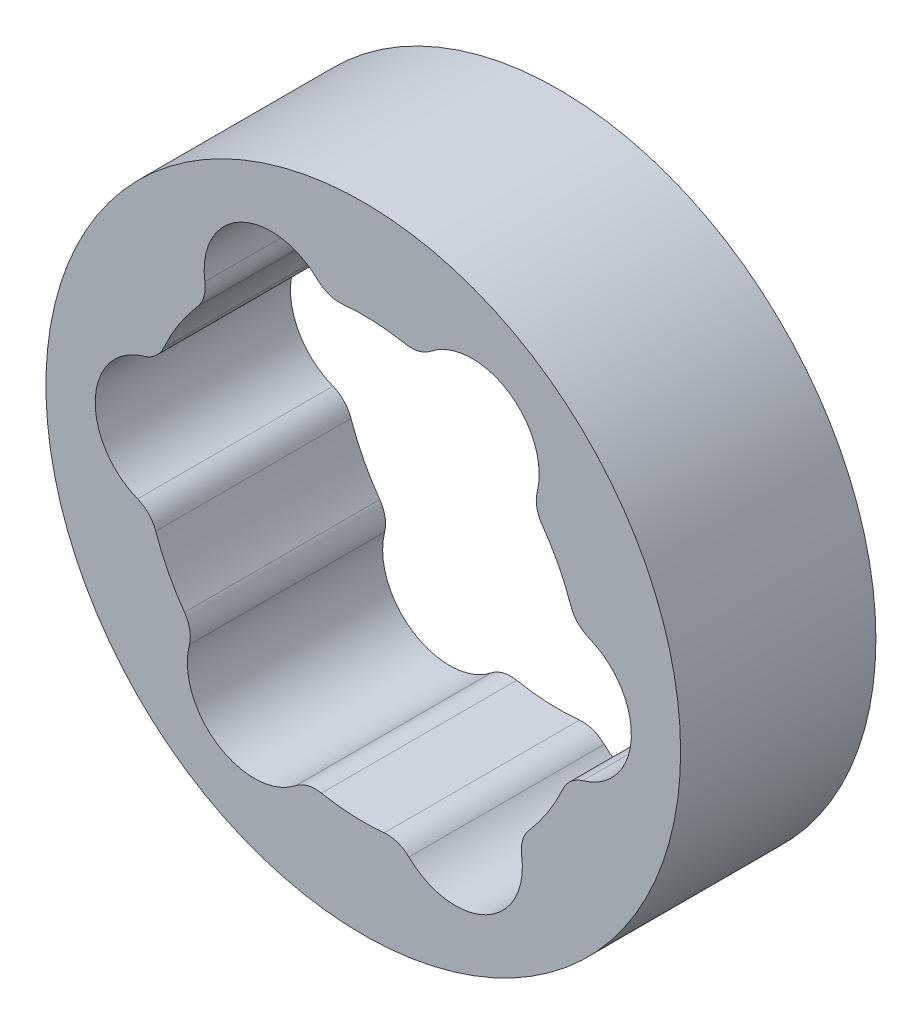
ISO-10303-21;
HEADER;
FILE_DESCRIPTION(('STEP AP214'),'2;1');
FILE_NAME('part.step','',(''),(''),'','','');
FILE_SCHEMA(('AUTOMOTIVE_DESIGN { 1 0 10303 214 1 1 1 1 }'));
ENDSEC;
DATA;
#1=APPLICATION_CONTEXT('core data for automotive mechanical design processes');
#2=APPLICATION_PROTOCOL_DEFINITION('international standard','automotive_design',2000,#1);
#3=PRODUCT_CONTEXT('',#1,'mechanical');
#4=PRODUCT('Part','Part','',(#3));
#5=PRODUCT_RELATED_PRODUCT_CATEGORY('part','',(#4));
#6=PRODUCT_DEFINITION_FORMATION('','',#4);
#7=PRODUCT_DEFINITION_CONTEXT('part definition',#1,'design');
#8=PRODUCT_DEFINITION('design','',#6,#7);
#9=PRODUCT_DEFINITION_SHAPE('','',#8);
#10=(LENGTH_UNIT() NAMED_UNIT(*) SI_UNIT(.MILLI.,.METRE.));
#11=(NAMED_UNIT(*) PLANE_ANGLE_UNIT() SI_UNIT($,.RADIAN.));
#12=(NAMED_UNIT(*) SI_UNIT($,.STERADIAN.) SOLID_ANGLE_UNIT());
#13=UNCERTAINTY_MEASURE_WITH_UNIT(LENGTH_MEASURE(1.E-05),#10,'distance_accuracy_value','');
#14=(GEOMETRIC_REPRESENTATION_CONTEXT(3) GLOBAL_UNCERTAINTY_ASSIGNED_CONTEXT((#13)) GLOBAL_UNIT_ASSIGNED_CONTEXT((#10,
#11,#12)) REPRESENTATION_CONTEXT('',''));
#15=CARTESIAN_POINT('',(0.,0.,0.));
#16=DIRECTION('',(0.,0.,1.));
#17=DIRECTION('',(1.,0.,0.));
#18=AXIS2_PLACEMENT_3D('',#15,#16,#17);
#19=CARTESIAN_POINT('',(0.,0.,12.7));
#20=DIRECTION('',(0.,0.,1.));
#21=DIRECTION('',(1.,0.,0.));
#22=AXIS2_PLACEMENT_3D('',#19,#20,#21);
#23=PLANE('',#22);
#24=CARTESIAN_POINT('',(596.895342550677,221.989731649152,12.7));
#25=DIRECTION('',(0.,0.,1.));
#26=DIRECTION('',(1.,0.,0.));
#27=AXIS2_PLACEMENT_3D('',#24,#25,#26);
#28=CIRCLE('',#27,20.6375);
#29=CARTESIAN_POINT('',(617.532842550677,221.989731649152,12.7));
#30=VERTEX_POINT('',#29);
#31=EDGE_CURVE('E244',#30,#30,#28,.T.);
#32=ORIENTED_EDGE('',*,*,#31,.T.);
#33=EDGE_LOOP('',(#32));
#34=FACE_BOUND('',#33,.T.);
#35=CARTESIAN_POINT('',(603.982524474659,233.003358987227,12.7));
#36=DIRECTION('',(0.,0.,1.));
#37=DIRECTION('',(1.,0.,0.));
#38=AXIS2_PLACEMENT_3D('',#35,#36,#37);
#39=CIRCLE('',#38,4.35292499999982);
#40=CARTESIAN_POINT('',(608.204995238954,231.945674393266,12.7));
#41=VERTEX_POINT('',#40);
#42=CARTESIAN_POINT('',(601.270344718915,236.408067055205,12.7));
#43=VERTEX_POINT('',#42);
#44=EDGE_CURVE('E345',#41,#43,#39,.T.);
#45=ORIENTED_EDGE('',*,*,#44,.F.);
#46=CARTESIAN_POINT('',(610.176097565101,231.451933955531,12.7));
#47=DIRECTION('',(0.,0.,1.));
#48=DIRECTION('',(1.,0.,0.));
#49=AXIS2_PLACEMENT_3D('',#46,#47,#48);
#50=CIRCLE('',#49,2.032);
#51=CARTESIAN_POINT('',(608.521174821871,230.272843325452,12.7));
#52=VERTEX_POINT('',#51);
#53=EDGE_CURVE('E293',#41,#52,#50,.T.);
#54=ORIENTED_EDGE('',*,*,#53,.T.);
#55=CARTESIAN_POINT('',(596.895342550677,221.989731649152,12.7));
#56=DIRECTION('',(0.,0.,1.));
#57=DIRECTION('',(1.,0.,0.));
#58=AXIS2_PLACEMENT_3D('',#55,#56,#57);
#59=CIRCLE('',#58,14.2748000000001);
#60=CARTESIAN_POINT('',(610.391687265941,226.639311669622,12.7));
#61=VERTEX_POINT('',#60);
#62=EDGE_CURVE('E358',#61,#52,#59,.T.);
#63=ORIENTED_EDGE('',*,*,#62,.F.);
#64=CARTESIAN_POINT('',(612.312875125765,227.301173594244,12.7));
#65=DIRECTION('',(0.,0.,1.));
#66=DIRECTION('',(1.,0.,0.));
#67=AXIS2_PLACEMENT_3D('',#64,#65,#66);
#68=CIRCLE('',#67,2.032);
#69=CARTESIAN_POINT('',(611.569488376722,225.410036332873,12.7));
#70=VERTEX_POINT('',#69);
#71=EDGE_CURVE('E239',#61,#70,#68,.T.);
#72=ORIENTED_EDGE('',*,*,#71,.T.);
#73=CARTESIAN_POINT('',(609.977014575256,221.358865730779,12.7));
#74=DIRECTION('',(0.,0.,1.));
#75=DIRECTION('',(1.,0.,0.));
#76=AXIS2_PLACEMENT_3D('',#73,#74,#75);
#77=CIRCLE('',#76,4.35292500000003);
#78=CARTESIAN_POINT('',(611.172268229842,217.173256485182,12.7));
#79=VERTEX_POINT('',#78);
#80=EDGE_CURVE('E343',#79,#70,#77,.T.);
#81=ORIENTED_EDGE('',*,*,#80,.F.);
#82=CARTESIAN_POINT('',(611.730227630961,215.219361578412,12.7));
#83=DIRECTION('',(0.,0.,1.));
#84=DIRECTION('',(1.,0.,0.));
#85=AXIS2_PLACEMENT_3D('',#82,#83,#84);
#86=CIRCLE('',#85,2.032);
#87=CARTESIAN_POINT('',(609.881643820334,216.063021400311,12.7));
#88=VERTEX_POINT('',#87);
#89=EDGE_CURVE('E276',#79,#88,#86,.T.);
#90=ORIENTED_EDGE('',*,*,#89,.T.);
#91=CARTESIAN_POINT('',(607.670169322965,212.626344277736,12.7));
#92=VERTEX_POINT('',#91);
#93=EDGE_CURVE('E364',#92,#88,#59,.T.);
#94=ORIENTED_EDGE('',*,*,#93,.F.);
#95=CARTESIAN_POINT('',(609.203952493397,211.293477747997,12.7));
#96=DIRECTION('',(0.,0.,1.));
#97=DIRECTION('',(1.,0.,0.));
#98=AXIS2_PLACEMENT_3D('',#95,#96,#97);
#99=CIRCLE('',#98,2.032);
#100=CARTESIAN_POINT('',(607.194486208485,210.991700926819,12.7));
#101=VERTEX_POINT('',#100);
#102=EDGE_CURVE('E278',#92,#101,#99,.T.);
#103=ORIENTED_EDGE('',*,*,#102,.T.);
#104=CARTESIAN_POINT('',(602.889832651274,210.345238392703,12.7));
#105=DIRECTION('',(0.,0.,1.));
#106=DIRECTION('',(1.,0.,0.));
#107=AXIS2_PLACEMENT_3D('',#104,#105,#106);
#108=CIRCLE('',#107,4.35292499999991);
#109=CARTESIAN_POINT('',(599.862615541565,207.217313741068,12.7));
#110=VERTEX_POINT('',#109);
#111=EDGE_CURVE('E360',#110,#101,#108,.T.);
#112=ORIENTED_EDGE('',*,*,#111,.F.);
#113=CARTESIAN_POINT('',(598.449472616536,205.757159272033,12.7));
#114=DIRECTION('',(0.,0.,1.));
#115=DIRECTION('',(1.,0.,0.));
#116=AXIS2_PLACEMENT_3D('',#113,#114,#115);
#117=CIRCLE('',#116,2.032);
#118=CARTESIAN_POINT('',(598.255811549139,207.779909724011,12.7));
#119=VERTEX_POINT('',#118);
#120=EDGE_CURVE('E280',#110,#119,#117,.T.);
#121=ORIENTED_EDGE('',*,*,#120,.T.);
#122=CARTESIAN_POINT('',(594.1738246077,207.976764257266,12.7));
#123=VERTEX_POINT('',#122);
#124=EDGE_CURVE('E363',#123,#119,#59,.T.);
#125=ORIENTED_EDGE('',*,*,#124,.F.);
#126=CARTESIAN_POINT('',(593.786419918309,205.982035802905,12.7));
#127=DIRECTION('',(0.,0.,1.));
#128=DIRECTION('',(1.,0.,0.));
#129=AXIS2_PLACEMENT_3D('',#126,#127,#128);
#130=CIRCLE('',#129,2.032);
#131=CARTESIAN_POINT('',(592.520340382439,207.571396243099,12.7));
#132=VERTEX_POINT('',#131);
#133=EDGE_CURVE('E282',#123,#132,#130,.T.);
#134=ORIENTED_EDGE('',*,*,#133,.T.);
#135=CARTESIAN_POINT('',(589.808160626695,210.976104311076,12.7));
#136=DIRECTION('',(0.,0.,1.));
#137=DIRECTION('',(1.,0.,0.));
#138=AXIS2_PLACEMENT_3D('',#135,#136,#137);
#139=CIRCLE('',#138,4.35292499999991);
#140=CARTESIAN_POINT('',(585.5856898624,212.033788905038,12.7));
#141=VERTEX_POINT('',#140);
#142=EDGE_CURVE('E365',#141,#132,#139,.T.);
#143=ORIENTED_EDGE('',*,*,#142,.F.);
#144=CARTESIAN_POINT('',(583.614587536252,212.527529342773,12.7));
#145=DIRECTION('',(0.,0.,1.));
#146=DIRECTION('',(1.,0.,0.));
#147=AXIS2_PLACEMENT_3D('',#144,#145,#146);
#148=CIRCLE('',#147,2.032);
#149=CARTESIAN_POINT('',(585.269510279483,213.706619972851,12.7));
#150=VERTEX_POINT('',#149);
#151=EDGE_CURVE('E284',#141,#150,#148,.T.);
#152=ORIENTED_EDGE('',*,*,#151,.T.);
#153=CARTESIAN_POINT('',(583.398997835413,217.340151628681,12.7));
#154=VERTEX_POINT('',#153);
#155=EDGE_CURVE('E368',#154,#150,#59,.T.);
#156=ORIENTED_EDGE('',*,*,#155,.F.);
#157=CARTESIAN_POINT('',(581.477809975588,216.678289704059,12.7));
#158=DIRECTION('',(0.,0.,1.));
#159=DIRECTION('',(1.,0.,0.));
#160=AXIS2_PLACEMENT_3D('',#157,#158,#159);
#161=CIRCLE('',#160,2.032);
#162=CARTESIAN_POINT('',(582.221196724632,218.569426965431,12.7));
#163=VERTEX_POINT('',#162);
#164=EDGE_CURVE('E273',#154,#163,#161,.T.);
#165=ORIENTED_EDGE('',*,*,#164,.T.);
#166=CARTESIAN_POINT('',(583.813670526097,222.620597567525,12.7));
#167=DIRECTION('',(0.,0.,1.));
#168=DIRECTION('',(1.,0.,0.));
#169=AXIS2_PLACEMENT_3D('',#166,#167,#168);
#170=CIRCLE('',#169,4.35292500000013);
#171=CARTESIAN_POINT('',(582.618416871512,226.806206813122,12.7));
#172=VERTEX_POINT('',#171);
#173=EDGE_CURVE('E369',#172,#163,#170,.T.);
#174=ORIENTED_EDGE('',*,*,#173,.F.);
#175=CARTESIAN_POINT('',(582.060457470393,228.760101719892,12.7));
#176=DIRECTION('',(0.,0.,1.));
#177=DIRECTION('',(1.,0.,0.));
#178=AXIS2_PLACEMENT_3D('',#175,#176,#177);
#179=CIRCLE('',#178,2.032);
#180=CARTESIAN_POINT('',(583.90904128102,227.916441897993,12.7));
#181=VERTEX_POINT('',#180);
#182=EDGE_CURVE('E286',#172,#181,#179,.T.);
#183=ORIENTED_EDGE('',*,*,#182,.T.);
#184=CARTESIAN_POINT('',(586.120515778389,231.353119020568,12.7));
#185=VERTEX_POINT('',#184);
#186=EDGE_CURVE('E359',#185,#181,#59,.T.);
#187=ORIENTED_EDGE('',*,*,#186,.F.);
#188=CARTESIAN_POINT('',(584.586732607957,232.685985550307,12.7));
#189=DIRECTION('',(0.,0.,1.));
#190=DIRECTION('',(1.,0.,0.));
#191=AXIS2_PLACEMENT_3D('',#188,#189,#190);
#192=CIRCLE('',#191,2.032);
#193=CARTESIAN_POINT('',(586.596198892869,232.987762371484,12.7));
#194=VERTEX_POINT('',#193);
#195=EDGE_CURVE('E288',#185,#194,#192,.T.);
#196=ORIENTED_EDGE('',*,*,#195,.T.);
#197=CARTESIAN_POINT('',(590.90085245008,233.6342249056,12.7));
#198=DIRECTION('',(0.,0.,1.));
#199=DIRECTION('',(1.,0.,0.));
#200=AXIS2_PLACEMENT_3D('',#197,#198,#199);
#201=CIRCLE('',#200,4.35292499999991);
#202=CARTESIAN_POINT('',(593.928069559789,236.762149557236,12.7));
#203=VERTEX_POINT('',#202);
#204=EDGE_CURVE('E352',#203,#194,#201,.T.);
#205=ORIENTED_EDGE('',*,*,#204,.F.);
#206=CARTESIAN_POINT('',(595.341212484818,238.22230402627,12.7));
#207=DIRECTION('',(0.,0.,1.));
#208=DIRECTION('',(1.,0.,0.));
#209=AXIS2_PLACEMENT_3D('',#206,#207,#208);
#210=CIRCLE('',#209,2.032);
#211=CARTESIAN_POINT('',(595.534873552214,236.199553574293,12.7));
#212=VERTEX_POINT('',#211);
#213=EDGE_CURVE('E66',#203,#212,#210,.T.);
#214=ORIENTED_EDGE('',*,*,#213,.T.);
#215=CARTESIAN_POINT('',(599.616860493654,236.002699041038,12.7));
#216=VERTEX_POINT('',#215);
#217=EDGE_CURVE('E355',#216,#212,#59,.T.);
#218=ORIENTED_EDGE('',*,*,#217,.F.);
#219=CARTESIAN_POINT('',(600.004265183046,237.997427495399,12.7));
#220=DIRECTION('',(0.,0.,1.));
#221=DIRECTION('',(1.,0.,0.));
#222=AXIS2_PLACEMENT_3D('',#219,#220,#221);
#223=CIRCLE('',#222,2.032);
#224=EDGE_CURVE('E291',#216,#43,#223,.T.);
#225=ORIENTED_EDGE('',*,*,#224,.T.);
#226=EDGE_LOOP('',(#45,#54,#63,#72,#81,#90,#94,#103,#112,#121,#125,#134,#143,#152,#156,#165,
#174,#183,#187,#196,#205,#214,#218,#225));
#227=FACE_BOUND('',#226,.T.);
#228=ADVANCED_FACE('F51',(#34,#227),#23,.T.);
#229=CARTESIAN_POINT('',(0.,0.,0.));
#230=DIRECTION('',(0.,0.,1.));
#231=DIRECTION('',(1.,0.,0.));
#232=AXIS2_PLACEMENT_3D('',#229,#230,#231);
#233=PLANE('',#232);
#234=CARTESIAN_POINT('',(596.895342550677,221.989731649152,0.));
#235=DIRECTION('',(0.,0.,1.));
#236=DIRECTION('',(1.,0.,0.));
#237=AXIS2_PLACEMENT_3D('',#234,#235,#236);
#238=CIRCLE('',#237,20.6375);
#239=CARTESIAN_POINT('',(617.532842550677,221.989731649152,0.));
#240=VERTEX_POINT('',#239);
#241=EDGE_CURVE('E356',#240,#240,#238,.T.);
#242=ORIENTED_EDGE('',*,*,#241,.F.);
#243=EDGE_LOOP('',(#242));
#244=FACE_BOUND('',#243,.T.);
#245=CARTESIAN_POINT('',(596.895342550677,221.989731649152,0.));
#246=DIRECTION('',(0.,0.,1.));
#247=DIRECTION('',(1.,0.,0.));
#248=AXIS2_PLACEMENT_3D('',#245,#246,#247);
#249=CIRCLE('',#248,14.2748000000001);
#250=CARTESIAN_POINT('',(610.391687265941,226.639311669622,0.));
#251=VERTEX_POINT('',#250);
#252=CARTESIAN_POINT('',(608.521174821871,230.272843325452,0.));
#253=VERTEX_POINT('',#252);
#254=EDGE_CURVE('E216',#251,#253,#249,.T.);
#255=ORIENTED_EDGE('',*,*,#254,.T.);
#256=CARTESIAN_POINT('',(610.176097565101,231.451933955531,0.));
#257=DIRECTION('',(0.,0.,1.));
#258=DIRECTION('',(1.,0.,0.));
#259=AXIS2_PLACEMENT_3D('',#256,#257,#258);
#260=CIRCLE('',#259,2.032);
#261=CARTESIAN_POINT('',(608.204995238954,231.945674393266,0.));
#262=VERTEX_POINT('',#261);
#263=EDGE_CURVE('E266',#253,#262,#260,.F.);
#264=ORIENTED_EDGE('',*,*,#263,.T.);
#265=CARTESIAN_POINT('',(603.982524474659,233.003358987227,0.));
#266=DIRECTION('',(0.,0.,1.));
#267=DIRECTION('',(1.,0.,0.));
#268=AXIS2_PLACEMENT_3D('',#265,#266,#267);
#269=CIRCLE('',#268,4.35292499999982);
#270=CARTESIAN_POINT('',(601.270344718915,236.408067055205,0.));
#271=VERTEX_POINT('',#270);
#272=EDGE_CURVE('E240',#271,#262,#269,.F.);
#273=ORIENTED_EDGE('',*,*,#272,.F.);
#274=CARTESIAN_POINT('',(600.004265183046,237.997427495399,0.));
#275=DIRECTION('',(0.,0.,1.));
#276=DIRECTION('',(1.,0.,0.));
#277=AXIS2_PLACEMENT_3D('',#274,#275,#276);
#278=CIRCLE('',#277,2.032);
#279=CARTESIAN_POINT('',(599.616860493654,236.002699041038,0.));
#280=VERTEX_POINT('',#279);
#281=EDGE_CURVE('E264',#271,#280,#278,.F.);
#282=ORIENTED_EDGE('',*,*,#281,.T.);
#283=CARTESIAN_POINT('',(595.534873552214,236.199553574293,0.));
#284=VERTEX_POINT('',#283);
#285=EDGE_CURVE('E235',#280,#284,#249,.T.);
#286=ORIENTED_EDGE('',*,*,#285,.T.);
#287=CARTESIAN_POINT('',(595.341212484818,238.22230402627,0.));
#288=DIRECTION('',(0.,0.,1.));
#289=DIRECTION('',(1.,0.,0.));
#290=AXIS2_PLACEMENT_3D('',#287,#288,#289);
#291=CIRCLE('',#290,2.032);
#292=CARTESIAN_POINT('',(593.928069559789,236.762149557236,0.));
#293=VERTEX_POINT('',#292);
#294=EDGE_CURVE('E262',#284,#293,#291,.F.);
#295=ORIENTED_EDGE('',*,*,#294,.T.);
#296=CARTESIAN_POINT('',(590.90085245008,233.6342249056,0.));
#297=DIRECTION('',(0.,0.,1.));
#298=DIRECTION('',(1.,0.,0.));
#299=AXIS2_PLACEMENT_3D('',#296,#297,#298);
#300=CIRCLE('',#299,4.35292499999991);
#301=CARTESIAN_POINT('',(586.596198892869,232.987762371484,0.));
#302=VERTEX_POINT('',#301);
#303=EDGE_CURVE('E348',#293,#302,#300,.T.);
#304=ORIENTED_EDGE('',*,*,#303,.T.);
#305=CARTESIAN_POINT('',(584.586732607957,232.685985550307,0.));
#306=DIRECTION('',(0.,0.,1.));
#307=DIRECTION('',(1.,0.,0.));
#308=AXIS2_PLACEMENT_3D('',#305,#306,#307);
#309=CIRCLE('',#308,2.032);
#310=CARTESIAN_POINT('',(586.120515778389,231.353119020568,0.));
#311=VERTEX_POINT('',#310);
#312=EDGE_CURVE('E260',#302,#311,#309,.F.);
#313=ORIENTED_EDGE('',*,*,#312,.T.);
#314=CARTESIAN_POINT('',(583.90904128102,227.916441897993,0.));
#315=VERTEX_POINT('',#314);
#316=EDGE_CURVE('E387',#311,#315,#249,.T.);
#317=ORIENTED_EDGE('',*,*,#316,.T.);
#318=CARTESIAN_POINT('',(582.060457470393,228.760101719892,0.));
#319=DIRECTION('',(0.,0.,1.));
#320=DIRECTION('',(1.,0.,0.));
#321=AXIS2_PLACEMENT_3D('',#318,#319,#320);
#322=CIRCLE('',#321,2.032);
#323=CARTESIAN_POINT('',(582.618416871512,226.806206813122,0.));
#324=VERTEX_POINT('',#323);
#325=EDGE_CURVE('E258',#315,#324,#322,.F.);
#326=ORIENTED_EDGE('',*,*,#325,.T.);
#327=CARTESIAN_POINT('',(583.813670526097,222.620597567525,0.));
#328=DIRECTION('',(0.,0.,1.));
#329=DIRECTION('',(1.,0.,0.));
#330=AXIS2_PLACEMENT_3D('',#327,#328,#329);
#331=CIRCLE('',#330,4.35292500000013);
#332=CARTESIAN_POINT('',(582.221196724632,218.569426965431,0.));
#333=VERTEX_POINT('',#332);
#334=EDGE_CURVE('E385',#324,#333,#331,.T.);
#335=ORIENTED_EDGE('',*,*,#334,.T.);
#336=CARTESIAN_POINT('',(581.477809975588,216.678289704059,0.));
#337=DIRECTION('',(0.,0.,1.));
#338=DIRECTION('',(1.,0.,0.));
#339=AXIS2_PLACEMENT_3D('',#336,#337,#338);
#340=CIRCLE('',#339,2.032);
#341=CARTESIAN_POINT('',(583.398997835413,217.340151628681,0.));
#342=VERTEX_POINT('',#341);
#343=EDGE_CURVE('E224',#333,#342,#340,.F.);
#344=ORIENTED_EDGE('',*,*,#343,.T.);
#345=CARTESIAN_POINT('',(585.269510279483,213.706619972851,0.));
#346=VERTEX_POINT('',#345);
#347=EDGE_CURVE('E384',#342,#346,#249,.T.);
#348=ORIENTED_EDGE('',*,*,#347,.T.);
#349=CARTESIAN_POINT('',(583.614587536252,212.527529342773,0.));
#350=DIRECTION('',(0.,0.,1.));
#351=DIRECTION('',(1.,0.,0.));
#352=AXIS2_PLACEMENT_3D('',#349,#350,#351);
#353=CIRCLE('',#352,2.032);
#354=CARTESIAN_POINT('',(585.5856898624,212.033788905038,0.));
#355=VERTEX_POINT('',#354);
#356=EDGE_CURVE('E256',#346,#355,#353,.F.);
#357=ORIENTED_EDGE('',*,*,#356,.T.);
#358=CARTESIAN_POINT('',(589.808160626695,210.976104311076,0.));
#359=DIRECTION('',(0.,0.,1.));
#360=DIRECTION('',(1.,0.,0.));
#361=AXIS2_PLACEMENT_3D('',#358,#359,#360);
#362=CIRCLE('',#361,4.35292499999991);
#363=CARTESIAN_POINT('',(592.520340382439,207.571396243099,0.));
#364=VERTEX_POINT('',#363);
#365=EDGE_CURVE('E381',#355,#364,#362,.T.);
#366=ORIENTED_EDGE('',*,*,#365,.T.);
#367=CARTESIAN_POINT('',(593.786419918309,205.982035802905,0.));
#368=DIRECTION('',(0.,0.,1.));
#369=DIRECTION('',(1.,0.,0.));
#370=AXIS2_PLACEMENT_3D('',#367,#368,#369);
#371=CIRCLE('',#370,2.032);
#372=CARTESIAN_POINT('',(594.1738246077,207.976764257266,0.));
#373=VERTEX_POINT('',#372);
#374=EDGE_CURVE('E254',#364,#373,#371,.F.);
#375=ORIENTED_EDGE('',*,*,#374,.T.);
#376=CARTESIAN_POINT('',(598.255811549139,207.779909724011,0.));
#377=VERTEX_POINT('',#376);
#378=EDGE_CURVE('E378',#373,#377,#249,.T.);
#379=ORIENTED_EDGE('',*,*,#378,.T.);
#380=CARTESIAN_POINT('',(598.449472616536,205.757159272033,0.));
#381=DIRECTION('',(0.,0.,1.));
#382=DIRECTION('',(1.,0.,0.));
#383=AXIS2_PLACEMENT_3D('',#380,#381,#382);
#384=CIRCLE('',#383,2.032);
#385=CARTESIAN_POINT('',(599.862615541565,207.217313741068,0.));
#386=VERTEX_POINT('',#385);
#387=EDGE_CURVE('E252',#377,#386,#384,.F.);
#388=ORIENTED_EDGE('',*,*,#387,.T.);
#389=CARTESIAN_POINT('',(602.889832651274,210.345238392703,0.));
#390=DIRECTION('',(0.,0.,1.));
#391=DIRECTION('',(1.,0.,0.));
#392=AXIS2_PLACEMENT_3D('',#389,#390,#391);
#393=CIRCLE('',#392,4.35292499999991);
#394=CARTESIAN_POINT('',(607.194486208485,210.991700926819,0.));
#395=VERTEX_POINT('',#394);
#396=EDGE_CURVE('E377',#386,#395,#393,.T.);
#397=ORIENTED_EDGE('',*,*,#396,.T.);
#398=CARTESIAN_POINT('',(609.203952493397,211.293477747997,0.));
#399=DIRECTION('',(0.,0.,1.));
#400=DIRECTION('',(1.,0.,0.));
#401=AXIS2_PLACEMENT_3D('',#398,#399,#400);
#402=CIRCLE('',#401,2.032);
#403=CARTESIAN_POINT('',(607.670169322965,212.626344277736,0.));
#404=VERTEX_POINT('',#403);
#405=EDGE_CURVE('E250',#395,#404,#402,.F.);
#406=ORIENTED_EDGE('',*,*,#405,.T.);
#407=CARTESIAN_POINT('',(609.881643820334,216.063021400311,0.));
#408=VERTEX_POINT('',#407);
#409=EDGE_CURVE('E234',#404,#408,#249,.T.);
#410=ORIENTED_EDGE('',*,*,#409,.T.);
#411=CARTESIAN_POINT('',(611.730227630961,215.219361578412,0.));
#412=DIRECTION('',(0.,0.,1.));
#413=DIRECTION('',(1.,0.,0.));
#414=AXIS2_PLACEMENT_3D('',#411,#412,#413);
#415=CIRCLE('',#414,2.032);
#416=CARTESIAN_POINT('',(611.172268229842,217.173256485182,0.));
#417=VERTEX_POINT('',#416);
#418=EDGE_CURVE('E223',#408,#417,#415,.F.);
#419=ORIENTED_EDGE('',*,*,#418,.T.);
#420=CARTESIAN_POINT('',(609.977014575256,221.358865730779,0.));
#421=DIRECTION('',(0.,0.,1.));
#422=DIRECTION('',(1.,0.,0.));
#423=AXIS2_PLACEMENT_3D('',#420,#421,#422);
#424=CIRCLE('',#423,4.35292500000003);
#425=CARTESIAN_POINT('',(611.569488376722,225.410036332873,0.));
#426=VERTEX_POINT('',#425);
#427=EDGE_CURVE('E218',#417,#426,#424,.T.);
#428=ORIENTED_EDGE('',*,*,#427,.T.);
#429=CARTESIAN_POINT('',(612.312875125765,227.301173594244,0.));
#430=DIRECTION('',(0.,0.,1.));
#431=DIRECTION('',(1.,0.,0.));
#432=AXIS2_PLACEMENT_3D('',#429,#430,#431);
#433=CIRCLE('',#432,2.032);
#434=EDGE_CURVE('E213',#426,#251,#433,.F.);
#435=ORIENTED_EDGE('',*,*,#434,.T.);
#436=EDGE_LOOP('',(#255,#264,#273,#282,#286,#295,#304,#313,#317,#326,#335,#344,#348,#357,#366,
#375,#379,#388,#397,#406,#410,#419,#428,#435));
#437=FACE_BOUND('',#436,.T.);
#438=ADVANCED_FACE('F215',(#244,#437),#233,.F.);
#439=CARTESIAN_POINT('',(590.90085245008,233.6342249056,12.7));
#440=DIRECTION('',(0.,0.,-1.));
#441=DIRECTION('',(-1.,0.,0.));
#442=AXIS2_PLACEMENT_3D('',#439,#440,#441);
#443=CYLINDRICAL_SURFACE('',#442,4.35292499999991);
#444=ORIENTED_EDGE('',*,*,#303,.F.);
#445=DIRECTION('',(0.,0.,-1.));
#446=VECTOR('',#445,1.);
#447=CARTESIAN_POINT('',(593.928069559789,236.762149557236,12.7));
#448=LINE('',#447,#446);
#449=EDGE_CURVE('E302',#293,#203,#448,.F.);
#450=ORIENTED_EDGE('',*,*,#449,.T.);
#451=ORIENTED_EDGE('',*,*,#204,.T.);
#452=DIRECTION('',(0.,0.,-1.));
#453=VECTOR('',#452,1.);
#454=CARTESIAN_POINT('',(586.596198892869,232.987762371484,12.7));
#455=LINE('',#454,#453);
#456=EDGE_CURVE('E299',#194,#302,#455,.T.);
#457=ORIENTED_EDGE('',*,*,#456,.T.);
#458=EDGE_LOOP('',(#444,#450,#451,#457));
#459=FACE_BOUND('',#458,.T.);
#460=ADVANCED_FACE('F453',(#459),#443,.F.);
#461=CARTESIAN_POINT('',(596.895342550677,221.989731649152,12.7));
#462=DIRECTION('',(0.,0.,-1.));
#463=DIRECTION('',(-1.,0.,0.));
#464=AXIS2_PLACEMENT_3D('',#461,#462,#463);
#465=CYLINDRICAL_SURFACE('',#464,14.2748000000001);
#466=ORIENTED_EDGE('',*,*,#285,.F.);
#467=DIRECTION('',(0.,0.,-1.));
#468=VECTOR('',#467,1.);
#469=CARTESIAN_POINT('',(599.616860493654,236.002699041038,12.7));
#470=LINE('',#469,#468);
#471=EDGE_CURVE('E73',#280,#216,#470,.F.);
#472=ORIENTED_EDGE('',*,*,#471,.T.);
#473=ORIENTED_EDGE('',*,*,#217,.T.);
#474=DIRECTION('',(0.,0.,-1.));
#475=VECTOR('',#474,1.);
#476=CARTESIAN_POINT('',(595.534873552214,236.199553574293,12.7));
#477=LINE('',#476,#475);
#478=EDGE_CURVE('E295',#212,#284,#477,.T.);
#479=ORIENTED_EDGE('',*,*,#478,.T.);
#480=EDGE_LOOP('',(#466,#472,#473,#479));
#481=FACE_BOUND('',#480,.T.);
#482=ADVANCED_FACE('F466',(#481),#465,.F.);
#483=ORIENTED_EDGE('',*,*,#62,.T.);
#484=DIRECTION('',(0.,0.,-1.));
#485=VECTOR('',#484,1.);
#486=CARTESIAN_POINT('',(608.521174821871,230.272843325452,12.7));
#487=LINE('',#486,#485);
#488=EDGE_CURVE('E233',#52,#253,#487,.T.);
#489=ORIENTED_EDGE('',*,*,#488,.T.);
#490=ORIENTED_EDGE('',*,*,#254,.F.);
#491=DIRECTION('',(0.,0.,-1.));
#492=VECTOR('',#491,1.);
#493=CARTESIAN_POINT('',(610.391687265941,226.639311669622,12.7));
#494=LINE('',#493,#492);
#495=EDGE_CURVE('E230',#251,#61,#494,.F.);
#496=ORIENTED_EDGE('',*,*,#495,.T.);
#497=EDGE_LOOP('',(#483,#489,#490,#496));
#498=FACE_BOUND('',#497,.T.);
#499=ADVANCED_FACE('F229',(#498),#465,.F.);
#500=ORIENTED_EDGE('',*,*,#409,.F.);
#501=DIRECTION('',(0.,0.,-1.));
#502=VECTOR('',#501,1.);
#503=CARTESIAN_POINT('',(607.670169322965,212.626344277736,12.7));
#504=LINE('',#503,#502);
#505=EDGE_CURVE('E337',#404,#92,#504,.F.);
#506=ORIENTED_EDGE('',*,*,#505,.T.);
#507=ORIENTED_EDGE('',*,*,#93,.T.);
#508=DIRECTION('',(0.,0.,-1.));
#509=VECTOR('',#508,1.);
#510=CARTESIAN_POINT('',(609.881643820334,216.063021400311,12.7));
#511=LINE('',#510,#509);
#512=EDGE_CURVE('E334',#88,#408,#511,.T.);
#513=ORIENTED_EDGE('',*,*,#512,.T.);
#514=EDGE_LOOP('',(#500,#506,#507,#513));
#515=FACE_BOUND('',#514,.T.);
#516=ADVANCED_FACE('F474',(#515),#465,.F.);
#517=CARTESIAN_POINT('',(602.889832651274,210.345238392703,12.7));
#518=DIRECTION('',(0.,0.,-1.));
#519=DIRECTION('',(-1.,0.,0.));
#520=AXIS2_PLACEMENT_3D('',#517,#518,#519);
#521=CYLINDRICAL_SURFACE('',#520,4.35292499999991);
#522=ORIENTED_EDGE('',*,*,#396,.F.);
#523=DIRECTION('',(0.,0.,-1.));
#524=VECTOR('',#523,1.);
#525=CARTESIAN_POINT('',(599.862615541565,207.217313741068,12.7));
#526=LINE('',#525,#524);
#527=EDGE_CURVE('E332',#386,#110,#526,.F.);
#528=ORIENTED_EDGE('',*,*,#527,.T.);
#529=ORIENTED_EDGE('',*,*,#111,.T.);
#530=DIRECTION('',(0.,0.,-1.));
#531=VECTOR('',#530,1.);
#532=CARTESIAN_POINT('',(607.194486208485,210.991700926819,12.7));
#533=LINE('',#532,#531);
#534=EDGE_CURVE('E329',#101,#395,#533,.T.);
#535=ORIENTED_EDGE('',*,*,#534,.T.);
#536=EDGE_LOOP('',(#522,#528,#529,#535));
#537=FACE_BOUND('',#536,.T.);
#538=ADVANCED_FACE('F471',(#537),#521,.F.);
#539=ORIENTED_EDGE('',*,*,#378,.F.);
#540=DIRECTION('',(0.,0.,-1.));
#541=VECTOR('',#540,1.);
#542=CARTESIAN_POINT('',(594.1738246077,207.976764257266,12.7));
#543=LINE('',#542,#541);
#544=EDGE_CURVE('E327',#373,#123,#543,.F.);
#545=ORIENTED_EDGE('',*,*,#544,.T.);
#546=ORIENTED_EDGE('',*,*,#124,.T.);
#547=DIRECTION('',(0.,0.,-1.));
#548=VECTOR('',#547,1.);
#549=CARTESIAN_POINT('',(598.255811549139,207.779909724011,12.7));
#550=LINE('',#549,#548);
#551=EDGE_CURVE('E324',#119,#377,#550,.T.);
#552=ORIENTED_EDGE('',*,*,#551,.T.);
#553=EDGE_LOOP('',(#539,#545,#546,#552));
#554=FACE_BOUND('',#553,.T.);
#555=ADVANCED_FACE('F401',(#554),#465,.F.);
#556=CARTESIAN_POINT('',(589.808160626695,210.976104311076,12.7));
#557=DIRECTION('',(0.,0.,-1.));
#558=DIRECTION('',(-1.,0.,0.));
#559=AXIS2_PLACEMENT_3D('',#556,#557,#558);
#560=CYLINDRICAL_SURFACE('',#559,4.35292499999991);
#561=ORIENTED_EDGE('',*,*,#365,.F.);
#562=DIRECTION('',(0.,0.,-1.));
#563=VECTOR('',#562,1.);
#564=CARTESIAN_POINT('',(585.5856898624,212.033788905038,12.7));
#565=LINE('',#564,#563);
#566=EDGE_CURVE('E322',#355,#141,#565,.F.);
#567=ORIENTED_EDGE('',*,*,#566,.T.);
#568=ORIENTED_EDGE('',*,*,#142,.T.);
#569=DIRECTION('',(0.,0.,-1.));
#570=VECTOR('',#569,1.);
#571=CARTESIAN_POINT('',(592.520340382439,207.571396243099,12.7));
#572=LINE('',#571,#570);
#573=EDGE_CURVE('E319',#132,#364,#572,.T.);
#574=ORIENTED_EDGE('',*,*,#573,.T.);
#575=EDGE_LOOP('',(#561,#567,#568,#574));
#576=FACE_BOUND('',#575,.T.);
#577=ADVANCED_FACE('F414',(#576),#560,.F.);
#578=ORIENTED_EDGE('',*,*,#155,.T.);
#579=DIRECTION('',(0.,0.,-1.));
#580=VECTOR('',#579,1.);
#581=CARTESIAN_POINT('',(585.269510279483,213.706619972851,12.7));
#582=LINE('',#581,#580);
#583=EDGE_CURVE('E316',#150,#346,#582,.T.);
#584=ORIENTED_EDGE('',*,*,#583,.T.);
#585=ORIENTED_EDGE('',*,*,#347,.F.);
#586=DIRECTION('',(0.,0.,-1.));
#587=VECTOR('',#586,1.);
#588=CARTESIAN_POINT('',(583.398997835413,217.340151628681,12.7));
#589=LINE('',#588,#587);
#590=EDGE_CURVE('E314',#342,#154,#589,.F.);
#591=ORIENTED_EDGE('',*,*,#590,.T.);
#592=EDGE_LOOP('',(#578,#584,#585,#591));
#593=FACE_BOUND('',#592,.T.);
#594=ADVANCED_FACE('F423',(#593),#465,.F.);
#595=CARTESIAN_POINT('',(583.813670526097,222.620597567525,12.7));
#596=DIRECTION('',(0.,0.,-1.));
#597=DIRECTION('',(-1.,0.,0.));
#598=AXIS2_PLACEMENT_3D('',#595,#596,#597);
#599=CYLINDRICAL_SURFACE('',#598,4.35292500000013);
#600=ORIENTED_EDGE('',*,*,#334,.F.);
#601=DIRECTION('',(0.,0.,-1.));
#602=VECTOR('',#601,1.);
#603=CARTESIAN_POINT('',(582.618416871512,226.806206813122,12.7));
#604=LINE('',#603,#602);
#605=EDGE_CURVE('E312',#324,#172,#604,.F.);
#606=ORIENTED_EDGE('',*,*,#605,.T.);
#607=ORIENTED_EDGE('',*,*,#173,.T.);
#608=DIRECTION('',(0.,0.,-1.));
#609=VECTOR('',#608,1.);
#610=CARTESIAN_POINT('',(582.221196724632,218.569426965431,12.7));
#611=LINE('',#610,#609);
#612=EDGE_CURVE('E309',#163,#333,#611,.T.);
#613=ORIENTED_EDGE('',*,*,#612,.T.);
#614=EDGE_LOOP('',(#600,#606,#607,#613));
#615=FACE_BOUND('',#614,.T.);
#616=ADVANCED_FACE('F438',(#615),#599,.F.);
#617=ORIENTED_EDGE('',*,*,#316,.F.);
#618=DIRECTION('',(0.,0.,-1.));
#619=VECTOR('',#618,1.);
#620=CARTESIAN_POINT('',(586.120515778389,231.353119020568,12.7));
#621=LINE('',#620,#619);
#622=EDGE_CURVE('E307',#311,#185,#621,.F.);
#623=ORIENTED_EDGE('',*,*,#622,.T.);
#624=ORIENTED_EDGE('',*,*,#186,.T.);
#625=DIRECTION('',(0.,0.,-1.));
#626=VECTOR('',#625,1.);
#627=CARTESIAN_POINT('',(583.90904128102,227.916441897993,12.7));
#628=LINE('',#627,#626);
#629=EDGE_CURVE('E304',#181,#315,#628,.T.);
#630=ORIENTED_EDGE('',*,*,#629,.T.);
#631=EDGE_LOOP('',(#617,#623,#624,#630));
#632=FACE_BOUND('',#631,.T.);
#633=ADVANCED_FACE('F429',(#632),#465,.F.);
#634=CARTESIAN_POINT('',(596.895342550677,221.989731649152,12.7));
#635=DIRECTION('',(0.,0.,-1.));
#636=DIRECTION('',(-1.,0.,0.));
#637=AXIS2_PLACEMENT_3D('',#634,#635,#636);
#638=CYLINDRICAL_SURFACE('',#637,20.6375);
#639=ORIENTED_EDGE('',*,*,#31,.F.);
#640=EDGE_LOOP('',(#639));
#641=FACE_BOUND('',#640,.T.);
#642=ORIENTED_EDGE('',*,*,#241,.T.);
#643=EDGE_LOOP('',(#642));
#644=FACE_BOUND('',#643,.T.);
#645=ADVANCED_FACE('F460',(#641,#644),#638,.T.);
#646=CARTESIAN_POINT('',(603.982524474659,233.003358987227,12.7));
#647=DIRECTION('',(0.,0.,-1.));
#648=DIRECTION('',(-1.,0.,0.));
#649=AXIS2_PLACEMENT_3D('',#646,#647,#648);
#650=CYLINDRICAL_SURFACE('',#649,4.35292499999982);
#651=ORIENTED_EDGE('',*,*,#272,.T.);
#652=DIRECTION('',(0.,0.,-1.));
#653=VECTOR('',#652,1.);
#654=CARTESIAN_POINT('',(608.204995238954,231.945674393266,12.7));
#655=LINE('',#654,#653);
#656=EDGE_CURVE('E271',#262,#41,#655,.F.);
#657=ORIENTED_EDGE('',*,*,#656,.T.);
#658=ORIENTED_EDGE('',*,*,#44,.T.);
#659=DIRECTION('',(0.,0.,-1.));
#660=VECTOR('',#659,1.);
#661=CARTESIAN_POINT('',(601.270344718915,236.408067055205,12.7));
#662=LINE('',#661,#660);
#663=EDGE_CURVE('E268',#43,#271,#662,.T.);
#664=ORIENTED_EDGE('',*,*,#663,.T.);
#665=EDGE_LOOP('',(#651,#657,#658,#664));
#666=FACE_BOUND('',#665,.T.);
#667=ADVANCED_FACE('F457',(#666),#650,.F.);
#668=CARTESIAN_POINT('',(609.977014575256,221.358865730779,12.7));
#669=DIRECTION('',(0.,0.,-1.));
#670=DIRECTION('',(-1.,0.,0.));
#671=AXIS2_PLACEMENT_3D('',#668,#669,#670);
#672=CYLINDRICAL_SURFACE('',#671,4.35292500000003);
#673=ORIENTED_EDGE('',*,*,#427,.F.);
#674=DIRECTION('',(0.,0.,-1.));
#675=VECTOR('',#674,1.);
#676=CARTESIAN_POINT('',(611.172268229842,217.173256485182,12.7));
#677=LINE('',#676,#675);
#678=EDGE_CURVE('E12',#417,#79,#677,.F.);
#679=ORIENTED_EDGE('',*,*,#678,.T.);
#680=ORIENTED_EDGE('',*,*,#80,.T.);
#681=DIRECTION('',(0.,0.,-1.));
#682=VECTOR('',#681,1.);
#683=CARTESIAN_POINT('',(611.569488376722,225.410036332873,12.7));
#684=LINE('',#683,#682);
#685=EDGE_CURVE('E59',#70,#426,#684,.T.);
#686=ORIENTED_EDGE('',*,*,#685,.T.);
#687=EDGE_LOOP('',(#673,#679,#680,#686));
#688=FACE_BOUND('',#687,.T.);
#689=ADVANCED_FACE('F340',(#688),#672,.F.);
#690=CARTESIAN_POINT('',(610.176097565101,231.451933955531,12.7));
#691=DIRECTION('',(0.,0.,-1.));
#692=DIRECTION('',(-1.,0.,0.));
#693=AXIS2_PLACEMENT_3D('',#690,#691,#692);
#694=CYLINDRICAL_SURFACE('',#693,2.032);
#695=ORIENTED_EDGE('',*,*,#53,.F.);
#696=ORIENTED_EDGE('',*,*,#656,.F.);
#697=ORIENTED_EDGE('',*,*,#263,.F.);
#698=ORIENTED_EDGE('',*,*,#488,.F.);
#699=EDGE_LOOP('',(#695,#696,#697,#698));
#700=FACE_BOUND('',#699,.T.);
#701=ADVANCED_FACE('F479',(#700),#694,.T.);
#702=CARTESIAN_POINT('',(600.004265183046,237.997427495399,12.7));
#703=DIRECTION('',(0.,0.,-1.));
#704=DIRECTION('',(-1.,0.,0.));
#705=AXIS2_PLACEMENT_3D('',#702,#703,#704);
#706=CYLINDRICAL_SURFACE('',#705,2.032);
#707=ORIENTED_EDGE('',*,*,#224,.F.);
#708=ORIENTED_EDGE('',*,*,#471,.F.);
#709=ORIENTED_EDGE('',*,*,#281,.F.);
#710=ORIENTED_EDGE('',*,*,#663,.F.);
#711=EDGE_LOOP('',(#707,#708,#709,#710));
#712=FACE_BOUND('',#711,.T.);
#713=ADVANCED_FACE('F482',(#712),#706,.T.);
#714=CARTESIAN_POINT('',(595.341212484818,238.22230402627,12.7));
#715=DIRECTION('',(0.,0.,-1.));
#716=DIRECTION('',(-1.,0.,0.));
#717=AXIS2_PLACEMENT_3D('',#714,#715,#716);
#718=CYLINDRICAL_SURFACE('',#717,2.032);
#719=ORIENTED_EDGE('',*,*,#213,.F.);
#720=ORIENTED_EDGE('',*,*,#449,.F.);
#721=ORIENTED_EDGE('',*,*,#294,.F.);
#722=ORIENTED_EDGE('',*,*,#478,.F.);
#723=EDGE_LOOP('',(#719,#720,#721,#722));
#724=FACE_BOUND('',#723,.T.);
#725=ADVANCED_FACE('F486',(#724),#718,.T.);
#726=CARTESIAN_POINT('',(584.586732607957,232.685985550307,12.7));
#727=DIRECTION('',(0.,0.,-1.));
#728=DIRECTION('',(-1.,0.,0.));
#729=AXIS2_PLACEMENT_3D('',#726,#727,#728);
#730=CYLINDRICAL_SURFACE('',#729,2.032);
#731=ORIENTED_EDGE('',*,*,#195,.F.);
#732=ORIENTED_EDGE('',*,*,#622,.F.);
#733=ORIENTED_EDGE('',*,*,#312,.F.);
#734=ORIENTED_EDGE('',*,*,#456,.F.);
#735=EDGE_LOOP('',(#731,#732,#733,#734));
#736=FACE_BOUND('',#735,.T.);
#737=ADVANCED_FACE('F490',(#736),#730,.T.);
#738=CARTESIAN_POINT('',(582.060457470393,228.760101719892,12.7));
#739=DIRECTION('',(0.,0.,-1.));
#740=DIRECTION('',(-1.,0.,0.));
#741=AXIS2_PLACEMENT_3D('',#738,#739,#740);
#742=CYLINDRICAL_SURFACE('',#741,2.032);
#743=ORIENTED_EDGE('',*,*,#182,.F.);
#744=ORIENTED_EDGE('',*,*,#605,.F.);
#745=ORIENTED_EDGE('',*,*,#325,.F.);
#746=ORIENTED_EDGE('',*,*,#629,.F.);
#747=EDGE_LOOP('',(#743,#744,#745,#746));
#748=FACE_BOUND('',#747,.T.);
#749=ADVANCED_FACE('F434',(#748),#742,.T.);
#750=CARTESIAN_POINT('',(583.614587536252,212.527529342773,12.7));
#751=DIRECTION('',(0.,0.,-1.));
#752=DIRECTION('',(-1.,0.,0.));
#753=AXIS2_PLACEMENT_3D('',#750,#751,#752);
#754=CYLINDRICAL_SURFACE('',#753,2.032);
#755=ORIENTED_EDGE('',*,*,#151,.F.);
#756=ORIENTED_EDGE('',*,*,#566,.F.);
#757=ORIENTED_EDGE('',*,*,#356,.F.);
#758=ORIENTED_EDGE('',*,*,#583,.F.);
#759=EDGE_LOOP('',(#755,#756,#757,#758));
#760=FACE_BOUND('',#759,.T.);
#761=ADVANCED_FACE('F417',(#760),#754,.T.);
#762=CARTESIAN_POINT('',(593.786419918309,205.982035802905,12.7));
#763=DIRECTION('',(0.,0.,-1.));
#764=DIRECTION('',(-1.,0.,0.));
#765=AXIS2_PLACEMENT_3D('',#762,#763,#764);
#766=CYLINDRICAL_SURFACE('',#765,2.032);
#767=ORIENTED_EDGE('',*,*,#133,.F.);
#768=ORIENTED_EDGE('',*,*,#544,.F.);
#769=ORIENTED_EDGE('',*,*,#374,.F.);
#770=ORIENTED_EDGE('',*,*,#573,.F.);
#771=EDGE_LOOP('',(#767,#768,#769,#770));
#772=FACE_BOUND('',#771,.T.);
#773=ADVANCED_FACE('F407',(#772),#766,.T.);
#774=CARTESIAN_POINT('',(598.449472616536,205.757159272033,12.7));
#775=DIRECTION('',(0.,0.,-1.));
#776=DIRECTION('',(-1.,0.,0.));
#777=AXIS2_PLACEMENT_3D('',#774,#775,#776);
#778=CYLINDRICAL_SURFACE('',#777,2.032);
#779=ORIENTED_EDGE('',*,*,#120,.F.);
#780=ORIENTED_EDGE('',*,*,#527,.F.);
#781=ORIENTED_EDGE('',*,*,#387,.F.);
#782=ORIENTED_EDGE('',*,*,#551,.F.);
#783=EDGE_LOOP('',(#779,#780,#781,#782));
#784=FACE_BOUND('',#783,.T.);
#785=ADVANCED_FACE('F501',(#784),#778,.T.);
#786=CARTESIAN_POINT('',(609.203952493397,211.293477747997,12.7));
#787=DIRECTION('',(0.,0.,-1.));
#788=DIRECTION('',(-1.,0.,0.));
#789=AXIS2_PLACEMENT_3D('',#786,#787,#788);
#790=CYLINDRICAL_SURFACE('',#789,2.032);
#791=ORIENTED_EDGE('',*,*,#102,.F.);
#792=ORIENTED_EDGE('',*,*,#505,.F.);
#793=ORIENTED_EDGE('',*,*,#405,.F.);
#794=ORIENTED_EDGE('',*,*,#534,.F.);
#795=EDGE_LOOP('',(#791,#792,#793,#794));
#796=FACE_BOUND('',#795,.T.);
#797=ADVANCED_FACE('F504',(#796),#790,.T.);
#798=CARTESIAN_POINT('',(611.730227630961,215.219361578412,12.7));
#799=DIRECTION('',(0.,0.,-1.));
#800=DIRECTION('',(-1.,0.,0.));
#801=AXIS2_PLACEMENT_3D('',#798,#799,#800);
#802=CYLINDRICAL_SURFACE('',#801,2.032);
#803=ORIENTED_EDGE('',*,*,#89,.F.);
#804=ORIENTED_EDGE('',*,*,#678,.F.);
#805=ORIENTED_EDGE('',*,*,#418,.F.);
#806=ORIENTED_EDGE('',*,*,#512,.F.);
#807=EDGE_LOOP('',(#803,#804,#805,#806));
#808=FACE_BOUND('',#807,.T.);
#809=ADVANCED_FACE('F446',(#808),#802,.T.);
#810=CARTESIAN_POINT('',(612.312875125765,227.301173594244,12.7));
#811=DIRECTION('',(0.,0.,-1.));
#812=DIRECTION('',(-1.,0.,0.));
#813=AXIS2_PLACEMENT_3D('',#810,#811,#812);
#814=CYLINDRICAL_SURFACE('',#813,2.032);
#815=ORIENTED_EDGE('',*,*,#71,.F.);
#816=ORIENTED_EDGE('',*,*,#495,.F.);
#817=ORIENTED_EDGE('',*,*,#434,.F.);
#818=ORIENTED_EDGE('',*,*,#685,.F.);
#819=EDGE_LOOP('',(#815,#816,#817,#818));
#820=FACE_BOUND('',#819,.T.);
#821=ADVANCED_FACE('F238',(#820),#814,.T.);
#822=CARTESIAN_POINT('',(581.477809975588,216.678289704059,12.7));
#823=DIRECTION('',(0.,0.,-1.));
#824=DIRECTION('',(-1.,0.,0.));
#825=AXIS2_PLACEMENT_3D('',#822,#823,#824);
#826=CYLINDRICAL_SURFACE('',#825,2.032);
#827=ORIENTED_EDGE('',*,*,#164,.F.);
#828=ORIENTED_EDGE('',*,*,#590,.F.);
#829=ORIENTED_EDGE('',*,*,#343,.F.);
#830=ORIENTED_EDGE('',*,*,#612,.F.);
#831=EDGE_LOOP('',(#827,#828,#829,#830));
#832=FACE_BOUND('',#831,.T.);
#833=ADVANCED_FACE('F53',(#832),#826,.T.);
#834=CLOSED_SHELL('',(#228,#438,#460,#482,#499,#516,#538,#555,#577,#594,#616,#633,#645,#667,
#689,#701,#713,#725,#737,#749,#761,#773,#785,#797,#809,#821,#833));
#835=MANIFOLD_SOLID_BREP('B2',#834);
#836=ADVANCED_BREP_SHAPE_REPRESENTATION('',(#18,#835),#14);
#837=SHAPE_DEFINITION_REPRESENTATION(#9,#836);
ENDSEC;
END-ISO-10303-21;
